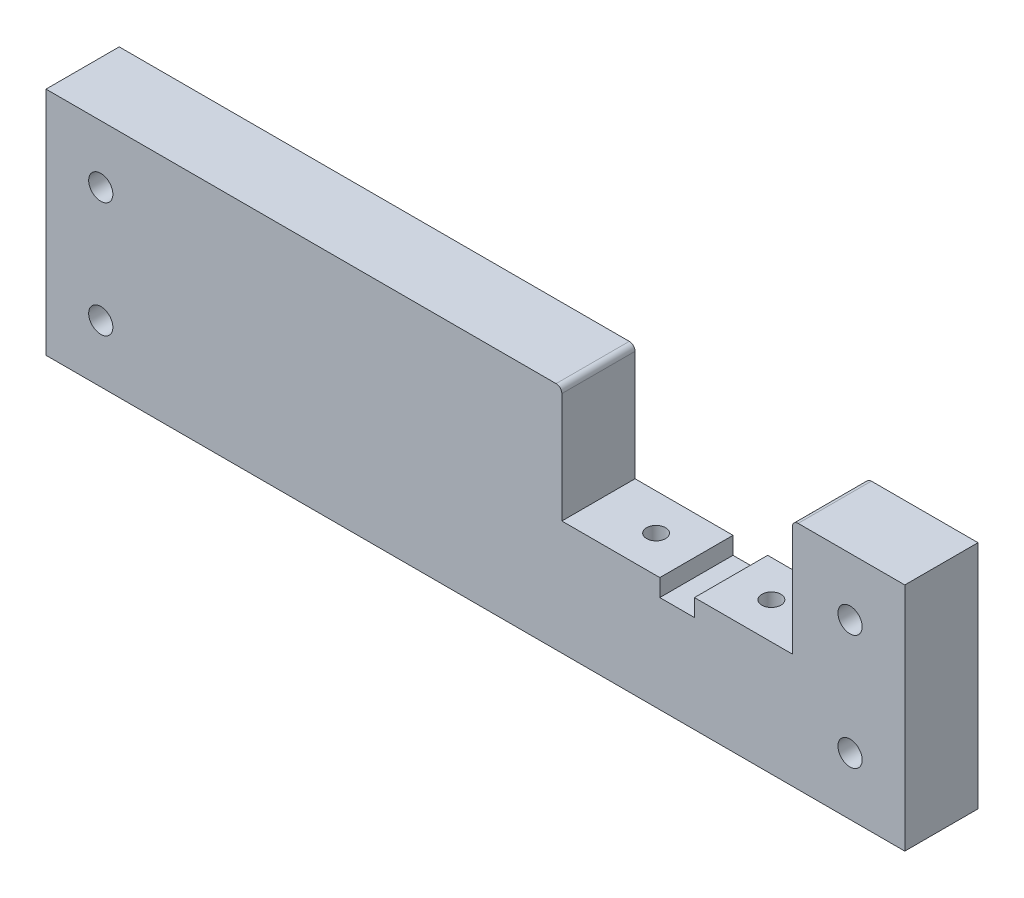
ISO-10303-21;
HEADER;
FILE_DESCRIPTION(('STEP AP214'),'2;1');
FILE_NAME('part.step','',(''),(''),'','','');
FILE_SCHEMA(('AUTOMOTIVE_DESIGN { 1 0 10303 214 1 1 1 1 }'));
ENDSEC;
DATA;
#1=APPLICATION_CONTEXT('core data for automotive mechanical design processes');
#2=APPLICATION_PROTOCOL_DEFINITION('international standard','automotive_design',2000,#1);
#3=PRODUCT_CONTEXT('',#1,'mechanical');
#4=PRODUCT('Part','Part','',(#3));
#5=PRODUCT_RELATED_PRODUCT_CATEGORY('part','',(#4));
#6=PRODUCT_DEFINITION_FORMATION('','',#4);
#7=PRODUCT_DEFINITION_CONTEXT('part definition',#1,'design');
#8=PRODUCT_DEFINITION('design','',#6,#7);
#9=PRODUCT_DEFINITION_SHAPE('','',#8);
#10=(LENGTH_UNIT() NAMED_UNIT(*) SI_UNIT(.MILLI.,.METRE.));
#11=(NAMED_UNIT(*) PLANE_ANGLE_UNIT() SI_UNIT($,.RADIAN.));
#12=(NAMED_UNIT(*) SI_UNIT($,.STERADIAN.) SOLID_ANGLE_UNIT());
#13=UNCERTAINTY_MEASURE_WITH_UNIT(LENGTH_MEASURE(1.E-05),#10,'distance_accuracy_value','');
#14=(GEOMETRIC_REPRESENTATION_CONTEXT(3) GLOBAL_UNCERTAINTY_ASSIGNED_CONTEXT((#13)) GLOBAL_UNIT_ASSIGNED_CONTEXT((#10,
#11,#12)) REPRESENTATION_CONTEXT('',''));
#15=CARTESIAN_POINT('',(0.,0.,0.));
#16=DIRECTION('',(0.,0.,1.));
#17=DIRECTION('',(1.,0.,0.));
#18=AXIS2_PLACEMENT_3D('',#15,#16,#17);
#19=CARTESIAN_POINT('',(55.,0.,-12.7));
#20=DIRECTION('',(1.,0.,0.));
#21=DIRECTION('',(0.,0.,-1.));
#22=AXIS2_PLACEMENT_3D('',#19,#20,#21);
#23=PLANE('',#22);
#24=DIRECTION('',(0.,1.,0.));
#25=VECTOR('',#24,1.);
#26=CARTESIAN_POINT('',(55.,0.,0.));
#27=LINE('',#26,#25);
#28=CARTESIAN_POINT('',(55.,19.855,0.));
#29=VERTEX_POINT('',#28);
#30=CARTESIAN_POINT('',(55.,39.,0.));
#31=VERTEX_POINT('',#30);
#32=EDGE_CURVE('E237',#29,#31,#27,.T.);
#33=ORIENTED_EDGE('',*,*,#32,.T.);
#34=DIRECTION('',(0.,0.,1.));
#35=VECTOR('',#34,1.);
#36=CARTESIAN_POINT('',(55.,39.,-12.7));
#37=LINE('',#36,#35);
#38=CARTESIAN_POINT('',(55.,39.,-12.7));
#39=VERTEX_POINT('',#38);
#40=EDGE_CURVE('E361',#31,#39,#37,.F.);
#41=ORIENTED_EDGE('',*,*,#40,.T.);
#42=DIRECTION('',(0.,1.,0.));
#43=VECTOR('',#42,1.);
#44=CARTESIAN_POINT('',(55.,0.,-12.7));
#45=LINE('',#44,#43);
#46=CARTESIAN_POINT('',(55.,19.855,-12.7));
#47=VERTEX_POINT('',#46);
#48=EDGE_CURVE('E238',#47,#39,#45,.T.);
#49=ORIENTED_EDGE('',*,*,#48,.F.);
#50=DIRECTION('',(0.,0.,1.));
#51=VECTOR('',#50,1.);
#52=CARTESIAN_POINT('',(55.,19.855,-12.7));
#53=LINE('',#52,#51);
#54=EDGE_CURVE('E348',#47,#29,#53,.T.);
#55=ORIENTED_EDGE('',*,*,#54,.T.);
#56=EDGE_LOOP('',(#33,#41,#49,#55));
#57=FACE_BOUND('',#56,.T.);
#58=ADVANCED_FACE('F40',(#57),#23,.F.);
#59=CARTESIAN_POINT('',(0.,40.,-12.7));
#60=DIRECTION('',(0.,-1.,0.));
#61=DIRECTION('',(0.,0.,-1.));
#62=AXIS2_PLACEMENT_3D('',#59,#60,#61);
#63=PLANE('',#62);
#64=DIRECTION('',(1.,0.,0.));
#65=VECTOR('',#64,1.);
#66=CARTESIAN_POINT('',(0.,40.,-12.7));
#67=LINE('',#66,#65);
#68=CARTESIAN_POINT('',(56.,40.,-12.7));
#69=VERTEX_POINT('',#68);
#70=CARTESIAN_POINT('',(74.5,40.,-12.7));
#71=VERTEX_POINT('',#70);
#72=EDGE_CURVE('E267',#69,#71,#67,.T.);
#73=ORIENTED_EDGE('',*,*,#72,.F.);
#74=DIRECTION('',(0.,0.,1.));
#75=VECTOR('',#74,1.);
#76=CARTESIAN_POINT('',(56.,40.,-12.7));
#77=LINE('',#76,#75);
#78=CARTESIAN_POINT('',(56.,40.,0.));
#79=VERTEX_POINT('',#78);
#80=EDGE_CURVE('E322',#69,#79,#77,.T.);
#81=ORIENTED_EDGE('',*,*,#80,.T.);
#82=DIRECTION('',(1.,0.,0.));
#83=VECTOR('',#82,1.);
#84=CARTESIAN_POINT('',(0.,40.,0.));
#85=LINE('',#84,#83);
#86=CARTESIAN_POINT('',(74.5,40.,0.));
#87=VERTEX_POINT('',#86);
#88=EDGE_CURVE('E243',#79,#87,#85,.T.);
#89=ORIENTED_EDGE('',*,*,#88,.T.);
#90=DIRECTION('',(0.,0.,1.));
#91=VECTOR('',#90,1.);
#92=CARTESIAN_POINT('',(74.5,40.,-12.7));
#93=LINE('',#92,#91);
#94=EDGE_CURVE('E318',#71,#87,#93,.T.);
#95=ORIENTED_EDGE('',*,*,#94,.F.);
#96=EDGE_LOOP('',(#73,#81,#89,#95));
#97=FACE_BOUND('',#96,.T.);
#98=ADVANCED_FACE('F414',(#97),#63,.F.);
#99=CARTESIAN_POINT('',(74.5,0.,-12.7));
#100=DIRECTION('',(-1.,0.,0.));
#101=DIRECTION('',(0.,0.,1.));
#102=AXIS2_PLACEMENT_3D('',#99,#100,#101);
#103=PLANE('',#102);
#104=DIRECTION('',(0.,-1.,0.));
#105=VECTOR('',#104,1.);
#106=CARTESIAN_POINT('',(74.5,0.,0.));
#107=LINE('',#106,#105);
#108=CARTESIAN_POINT('',(74.5,0.,0.));
#109=VERTEX_POINT('',#108);
#110=EDGE_CURVE('E314',#87,#109,#107,.T.);
#111=ORIENTED_EDGE('',*,*,#110,.T.);
#112=DIRECTION('',(0.,0.,1.));
#113=VECTOR('',#112,1.);
#114=CARTESIAN_POINT('',(74.5,0.,-12.7));
#115=LINE('',#114,#113);
#116=CARTESIAN_POINT('',(74.5,0.,-12.7));
#117=VERTEX_POINT('',#116);
#118=EDGE_CURVE('E323',#117,#109,#115,.T.);
#119=ORIENTED_EDGE('',*,*,#118,.F.);
#120=DIRECTION('',(0.,-1.,0.));
#121=VECTOR('',#120,1.);
#122=CARTESIAN_POINT('',(74.5,0.,-12.7));
#123=LINE('',#122,#121);
#124=EDGE_CURVE('E275',#71,#117,#123,.T.);
#125=ORIENTED_EDGE('',*,*,#124,.F.);
#126=ORIENTED_EDGE('',*,*,#94,.T.);
#127=EDGE_LOOP('',(#111,#119,#125,#126));
#128=FACE_BOUND('',#127,.T.);
#129=ADVANCED_FACE('F420',(#128),#103,.F.);
#130=CARTESIAN_POINT('',(0.,0.,-12.7));
#131=DIRECTION('',(0.,-1.,0.));
#132=DIRECTION('',(1.,0.,0.));
#133=AXIS2_PLACEMENT_3D('',#130,#131,#132);
#134=PLANE('',#133);
#135=CARTESIAN_POINT('',(-60.,0.,-6.35));
#136=DIRECTION('',(0.,-1.,0.));
#137=DIRECTION('',(0.,0.,-1.));
#138=AXIS2_PLACEMENT_3D('',#135,#136,#137);
#139=CIRCLE('',#138,2.09999999999999);
#140=CARTESIAN_POINT('',(-60.,0.,-8.44999999999999));
#141=VERTEX_POINT('',#140);
#142=EDGE_CURVE('E168',#141,#141,#139,.T.);
#143=ORIENTED_EDGE('',*,*,#142,.F.);
#144=EDGE_LOOP('',(#143));
#145=FACE_BOUND('',#144,.T.);
#146=CARTESIAN_POINT('',(0.,0.,-6.35));
#147=DIRECTION('',(0.,-1.,0.));
#148=DIRECTION('',(0.,0.,-1.));
#149=AXIS2_PLACEMENT_3D('',#146,#147,#148);
#150=CIRCLE('',#149,2.09999999999999);
#151=CARTESIAN_POINT('',(0.,0.,-8.44999999999999));
#152=VERTEX_POINT('',#151);
#153=EDGE_CURVE('E167',#152,#152,#150,.T.);
#154=ORIENTED_EDGE('',*,*,#153,.F.);
#155=EDGE_LOOP('',(#154));
#156=FACE_BOUND('',#155,.T.);
#157=CARTESIAN_POINT('',(60.,0.,-6.35));
#158=DIRECTION('',(0.,-1.,0.));
#159=DIRECTION('',(0.,0.,-1.));
#160=AXIS2_PLACEMENT_3D('',#157,#158,#159);
#161=CIRCLE('',#160,2.09999999999999);
#162=CARTESIAN_POINT('',(60.,0.,-8.44999999999999));
#163=VERTEX_POINT('',#162);
#164=EDGE_CURVE('E181',#163,#163,#161,.T.);
#165=ORIENTED_EDGE('',*,*,#164,.F.);
#166=EDGE_LOOP('',(#165));
#167=FACE_BOUND('',#166,.T.);
#168=DIRECTION('',(1.,0.,0.));
#169=VECTOR('',#168,1.);
#170=CARTESIAN_POINT('',(0.,0.,0.));
#171=LINE('',#170,#169);
#172=CARTESIAN_POINT('',(-74.5,0.,0.));
#173=VERTEX_POINT('',#172);
#174=EDGE_CURVE('E310',#173,#109,#171,.T.);
#175=ORIENTED_EDGE('',*,*,#174,.F.);
#176=DIRECTION('',(0.,0.,1.));
#177=VECTOR('',#176,1.);
#178=CARTESIAN_POINT('',(-74.5,0.,-12.7));
#179=LINE('',#178,#177);
#180=CARTESIAN_POINT('',(-74.5,0.,-12.7));
#181=VERTEX_POINT('',#180);
#182=EDGE_CURVE('E326',#181,#173,#179,.T.);
#183=ORIENTED_EDGE('',*,*,#182,.F.);
#184=DIRECTION('',(1.,0.,0.));
#185=VECTOR('',#184,1.);
#186=CARTESIAN_POINT('',(0.,0.,-12.7));
#187=LINE('',#186,#185);
#188=EDGE_CURVE('E271',#181,#117,#187,.T.);
#189=ORIENTED_EDGE('',*,*,#188,.T.);
#190=ORIENTED_EDGE('',*,*,#118,.T.);
#191=EDGE_LOOP('',(#175,#183,#189,#190));
#192=FACE_BOUND('',#191,.T.);
#193=ADVANCED_FACE('F425',(#145,#156,#167,#192),#134,.T.);
#194=CARTESIAN_POINT('',(-74.5,0.,-12.7));
#195=DIRECTION('',(-1.,0.,0.));
#196=DIRECTION('',(0.,0.,1.));
#197=AXIS2_PLACEMENT_3D('',#194,#195,#196);
#198=PLANE('',#197);
#199=DIRECTION('',(0.,-1.,0.));
#200=VECTOR('',#199,1.);
#201=CARTESIAN_POINT('',(-74.5,0.,0.));
#202=LINE('',#201,#200);
#203=CARTESIAN_POINT('',(-74.5,40.,0.));
#204=VERTEX_POINT('',#203);
#205=EDGE_CURVE('E306',#204,#173,#202,.T.);
#206=ORIENTED_EDGE('',*,*,#205,.F.);
#207=DIRECTION('',(0.,0.,1.));
#208=VECTOR('',#207,1.);
#209=CARTESIAN_POINT('',(-74.5,40.,-12.7));
#210=LINE('',#209,#208);
#211=CARTESIAN_POINT('',(-74.5,40.,-12.7));
#212=VERTEX_POINT('',#211);
#213=EDGE_CURVE('E329',#212,#204,#210,.T.);
#214=ORIENTED_EDGE('',*,*,#213,.F.);
#215=DIRECTION('',(0.,-1.,0.));
#216=VECTOR('',#215,1.);
#217=CARTESIAN_POINT('',(-74.5,0.,-12.7));
#218=LINE('',#217,#216);
#219=EDGE_CURVE('E266',#212,#181,#218,.T.);
#220=ORIENTED_EDGE('',*,*,#219,.T.);
#221=ORIENTED_EDGE('',*,*,#182,.T.);
#222=EDGE_LOOP('',(#206,#214,#220,#221));
#223=FACE_BOUND('',#222,.T.);
#224=ADVANCED_FACE('F429',(#223),#198,.T.);
#225=CARTESIAN_POINT('',(14.,40.,0.));
#226=VERTEX_POINT('',#225);
#227=EDGE_CURVE('E303',#204,#226,#85,.T.);
#228=ORIENTED_EDGE('',*,*,#227,.T.);
#229=DIRECTION('',(0.,0.,1.));
#230=VECTOR('',#229,1.);
#231=CARTESIAN_POINT('',(14.,40.,-12.7));
#232=LINE('',#231,#230);
#233=CARTESIAN_POINT('',(14.,40.,-12.7));
#234=VERTEX_POINT('',#233);
#235=EDGE_CURVE('E11',#226,#234,#232,.F.);
#236=ORIENTED_EDGE('',*,*,#235,.T.);
#237=EDGE_CURVE('E263',#212,#234,#67,.T.);
#238=ORIENTED_EDGE('',*,*,#237,.F.);
#239=ORIENTED_EDGE('',*,*,#213,.T.);
#240=EDGE_LOOP('',(#228,#236,#238,#239));
#241=FACE_BOUND('',#240,.T.);
#242=ADVANCED_FACE('F430',(#241),#63,.F.);
#243=CARTESIAN_POINT('',(15.,0.,-12.7));
#244=DIRECTION('',(1.,0.,0.));
#245=DIRECTION('',(0.,1.,0.));
#246=AXIS2_PLACEMENT_3D('',#243,#244,#245);
#247=PLANE('',#246);
#248=DIRECTION('',(0.,1.,0.));
#249=VECTOR('',#248,1.);
#250=CARTESIAN_POINT('',(15.,0.,-12.7));
#251=LINE('',#250,#249);
#252=CARTESIAN_POINT('',(15.,19.855,-12.7));
#253=VERTEX_POINT('',#252);
#254=CARTESIAN_POINT('',(15.,39.,-12.7));
#255=VERTEX_POINT('',#254);
#256=EDGE_CURVE('E260',#253,#255,#251,.T.);
#257=ORIENTED_EDGE('',*,*,#256,.T.);
#258=DIRECTION('',(0.,0.,1.));
#259=VECTOR('',#258,1.);
#260=CARTESIAN_POINT('',(15.,39.,0.));
#261=LINE('',#260,#259);
#262=CARTESIAN_POINT('',(15.,39.,0.));
#263=VERTEX_POINT('',#262);
#264=EDGE_CURVE('E49',#255,#263,#261,.T.);
#265=ORIENTED_EDGE('',*,*,#264,.T.);
#266=DIRECTION('',(0.,1.,0.));
#267=VECTOR('',#266,1.);
#268=CARTESIAN_POINT('',(15.,0.,0.));
#269=LINE('',#268,#267);
#270=CARTESIAN_POINT('',(15.,19.855,0.));
#271=VERTEX_POINT('',#270);
#272=EDGE_CURVE('E299',#271,#263,#269,.T.);
#273=ORIENTED_EDGE('',*,*,#272,.F.);
#274=DIRECTION('',(0.,0.,1.));
#275=VECTOR('',#274,1.);
#276=CARTESIAN_POINT('',(15.,19.855,-12.7));
#277=LINE('',#276,#275);
#278=EDGE_CURVE('E332',#253,#271,#277,.T.);
#279=ORIENTED_EDGE('',*,*,#278,.F.);
#280=EDGE_LOOP('',(#257,#265,#273,#279));
#281=FACE_BOUND('',#280,.T.);
#282=ADVANCED_FACE('F373',(#281),#247,.T.);
#283=CARTESIAN_POINT('',(0.,19.855,-12.7));
#284=DIRECTION('',(0.,1.,0.));
#285=DIRECTION('',(-1.,0.,0.));
#286=AXIS2_PLACEMENT_3D('',#283,#284,#285);
#287=PLANE('',#286);
#288=CARTESIAN_POINT('',(25.,19.855,-6.35));
#289=DIRECTION('',(0.,1.,0.));
#290=DIRECTION('',(0.,0.,1.));
#291=AXIS2_PLACEMENT_3D('',#288,#289,#290);
#292=CIRCLE('',#291,1.64999999999999);
#293=CARTESIAN_POINT('',(25.,19.855,-4.70000000000001));
#294=VERTEX_POINT('',#293);
#295=EDGE_CURVE('E221',#294,#294,#292,.T.);
#296=ORIENTED_EDGE('',*,*,#295,.F.);
#297=EDGE_LOOP('',(#296));
#298=FACE_BOUND('',#297,.T.);
#299=DIRECTION('',(-1.,0.,0.));
#300=VECTOR('',#299,1.);
#301=CARTESIAN_POINT('',(0.,19.855,0.));
#302=LINE('',#301,#300);
#303=CARTESIAN_POINT('',(31.995,19.855,0.));
#304=VERTEX_POINT('',#303);
#305=EDGE_CURVE('E295',#304,#271,#302,.T.);
#306=ORIENTED_EDGE('',*,*,#305,.F.);
#307=DIRECTION('',(0.,0.,1.));
#308=VECTOR('',#307,1.);
#309=CARTESIAN_POINT('',(31.995,19.855,-12.7));
#310=LINE('',#309,#308);
#311=CARTESIAN_POINT('',(31.995,19.855,-12.7));
#312=VERTEX_POINT('',#311);
#313=EDGE_CURVE('E335',#312,#304,#310,.T.);
#314=ORIENTED_EDGE('',*,*,#313,.F.);
#315=DIRECTION('',(-1.,0.,0.));
#316=VECTOR('',#315,1.);
#317=CARTESIAN_POINT('',(0.,19.855,-12.7));
#318=LINE('',#317,#316);
#319=EDGE_CURVE('E256',#312,#253,#318,.T.);
#320=ORIENTED_EDGE('',*,*,#319,.T.);
#321=ORIENTED_EDGE('',*,*,#278,.T.);
#322=EDGE_LOOP('',(#306,#314,#320,#321));
#323=FACE_BOUND('',#322,.T.);
#324=ADVANCED_FACE('F383',(#298,#323),#287,.T.);
#325=CARTESIAN_POINT('',(31.995,0.,-12.7));
#326=DIRECTION('',(-1.,0.,0.));
#327=DIRECTION('',(0.,0.,1.));
#328=AXIS2_PLACEMENT_3D('',#325,#326,#327);
#329=PLANE('',#328);
#330=DIRECTION('',(0.,-1.,0.));
#331=VECTOR('',#330,1.);
#332=CARTESIAN_POINT('',(31.995,0.,0.));
#333=LINE('',#332,#331);
#334=CARTESIAN_POINT('',(31.995,16.85,0.));
#335=VERTEX_POINT('',#334);
#336=EDGE_CURVE('E292',#304,#335,#333,.T.);
#337=ORIENTED_EDGE('',*,*,#336,.T.);
#338=DIRECTION('',(0.,0.,1.));
#339=VECTOR('',#338,1.);
#340=CARTESIAN_POINT('',(31.995,16.85,-12.7));
#341=LINE('',#340,#339);
#342=CARTESIAN_POINT('',(31.995,16.85,-12.7));
#343=VERTEX_POINT('',#342);
#344=EDGE_CURVE('E338',#343,#335,#341,.T.);
#345=ORIENTED_EDGE('',*,*,#344,.F.);
#346=DIRECTION('',(0.,-1.,0.));
#347=VECTOR('',#346,1.);
#348=CARTESIAN_POINT('',(31.995,0.,-12.7));
#349=LINE('',#348,#347);
#350=EDGE_CURVE('E253',#312,#343,#349,.T.);
#351=ORIENTED_EDGE('',*,*,#350,.F.);
#352=ORIENTED_EDGE('',*,*,#313,.T.);
#353=EDGE_LOOP('',(#337,#345,#351,#352));
#354=FACE_BOUND('',#353,.T.);
#355=ADVANCED_FACE('F392',(#354),#329,.F.);
#356=CARTESIAN_POINT('',(0.,16.85,-12.7));
#357=DIRECTION('',(0.,-1.,0.));
#358=DIRECTION('',(0.,0.,-1.));
#359=AXIS2_PLACEMENT_3D('',#356,#357,#358);
#360=PLANE('',#359);
#361=DIRECTION('',(1.,0.,0.));
#362=VECTOR('',#361,1.);
#363=CARTESIAN_POINT('',(0.,16.85,0.));
#364=LINE('',#363,#362);
#365=CARTESIAN_POINT('',(38.005,16.85,0.));
#366=VERTEX_POINT('',#365);
#367=EDGE_CURVE('E288',#335,#366,#364,.T.);
#368=ORIENTED_EDGE('',*,*,#367,.T.);
#369=DIRECTION('',(0.,0.,1.));
#370=VECTOR('',#369,1.);
#371=CARTESIAN_POINT('',(38.005,16.85,-12.7));
#372=LINE('',#371,#370);
#373=CARTESIAN_POINT('',(38.005,16.85,-12.7));
#374=VERTEX_POINT('',#373);
#375=EDGE_CURVE('E342',#374,#366,#372,.T.);
#376=ORIENTED_EDGE('',*,*,#375,.F.);
#377=DIRECTION('',(1.,0.,0.));
#378=VECTOR('',#377,1.);
#379=CARTESIAN_POINT('',(0.,16.85,-12.7));
#380=LINE('',#379,#378);
#381=EDGE_CURVE('E250',#343,#374,#380,.T.);
#382=ORIENTED_EDGE('',*,*,#381,.F.);
#383=ORIENTED_EDGE('',*,*,#344,.T.);
#384=EDGE_LOOP('',(#368,#376,#382,#383));
#385=FACE_BOUND('',#384,.T.);
#386=ADVANCED_FACE('F394',(#385),#360,.F.);
#387=CARTESIAN_POINT('',(38.005,0.,-12.7));
#388=DIRECTION('',(-1.,0.,0.));
#389=DIRECTION('',(0.,0.,1.));
#390=AXIS2_PLACEMENT_3D('',#387,#388,#389);
#391=PLANE('',#390);
#392=DIRECTION('',(0.,-1.,0.));
#393=VECTOR('',#392,1.);
#394=CARTESIAN_POINT('',(38.005,0.,0.));
#395=LINE('',#394,#393);
#396=CARTESIAN_POINT('',(38.005,19.855,0.));
#397=VERTEX_POINT('',#396);
#398=EDGE_CURVE('E284',#397,#366,#395,.T.);
#399=ORIENTED_EDGE('',*,*,#398,.F.);
#400=DIRECTION('',(0.,0.,1.));
#401=VECTOR('',#400,1.);
#402=CARTESIAN_POINT('',(38.005,19.855,-12.7));
#403=LINE('',#402,#401);
#404=CARTESIAN_POINT('',(38.005,19.855,-12.7));
#405=VERTEX_POINT('',#404);
#406=EDGE_CURVE('E345',#405,#397,#403,.T.);
#407=ORIENTED_EDGE('',*,*,#406,.F.);
#408=DIRECTION('',(0.,-1.,0.));
#409=VECTOR('',#408,1.);
#410=CARTESIAN_POINT('',(38.005,0.,-12.7));
#411=LINE('',#410,#409);
#412=EDGE_CURVE('E246',#405,#374,#411,.T.);
#413=ORIENTED_EDGE('',*,*,#412,.T.);
#414=ORIENTED_EDGE('',*,*,#375,.T.);
#415=EDGE_LOOP('',(#399,#407,#413,#414));
#416=FACE_BOUND('',#415,.T.);
#417=ADVANCED_FACE('F397',(#416),#391,.T.);
#418=CARTESIAN_POINT('',(0.,19.855,-12.7));
#419=DIRECTION('',(0.,-1.,0.));
#420=DIRECTION('',(1.,0.,0.));
#421=AXIS2_PLACEMENT_3D('',#418,#419,#420);
#422=PLANE('',#421);
#423=CARTESIAN_POINT('',(45.,19.855,-6.35));
#424=DIRECTION('',(0.,1.,0.));
#425=DIRECTION('',(0.,0.,1.));
#426=AXIS2_PLACEMENT_3D('',#423,#424,#425);
#427=CIRCLE('',#426,1.64999999999999);
#428=CARTESIAN_POINT('',(45.,19.855,-4.70000000000001));
#429=VERTEX_POINT('',#428);
#430=EDGE_CURVE('E229',#429,#429,#427,.T.);
#431=ORIENTED_EDGE('',*,*,#430,.F.);
#432=EDGE_LOOP('',(#431));
#433=FACE_BOUND('',#432,.T.);
#434=DIRECTION('',(1.,0.,0.));
#435=VECTOR('',#434,1.);
#436=CARTESIAN_POINT('',(0.,19.855,0.));
#437=LINE('',#436,#435);
#438=EDGE_CURVE('E281',#397,#29,#437,.T.);
#439=ORIENTED_EDGE('',*,*,#438,.T.);
#440=ORIENTED_EDGE('',*,*,#54,.F.);
#441=DIRECTION('',(1.,0.,0.));
#442=VECTOR('',#441,1.);
#443=CARTESIAN_POINT('',(0.,19.855,-12.7));
#444=LINE('',#443,#442);
#445=EDGE_CURVE('E242',#405,#47,#444,.T.);
#446=ORIENTED_EDGE('',*,*,#445,.F.);
#447=ORIENTED_EDGE('',*,*,#406,.T.);
#448=EDGE_LOOP('',(#439,#440,#446,#447));
#449=FACE_BOUND('',#448,.T.);
#450=ADVANCED_FACE('F403',(#433,#449),#422,.F.);
#451=CARTESIAN_POINT('',(0.,0.,-12.7));
#452=DIRECTION('',(0.,0.,1.));
#453=DIRECTION('',(1.,0.,0.));
#454=AXIS2_PLACEMENT_3D('',#451,#452,#453);
#455=PLANE('',#454);
#456=CARTESIAN_POINT('',(-65.,30.,-12.7));
#457=DIRECTION('',(0.,0.,1.));
#458=DIRECTION('',(1.,0.,0.));
#459=AXIS2_PLACEMENT_3D('',#456,#457,#458);
#460=CIRCLE('',#459,2.09999999999999);
#461=CARTESIAN_POINT('',(-62.9,30.,-12.7));
#462=VERTEX_POINT('',#461);
#463=EDGE_CURVE('E193',#462,#462,#460,.T.);
#464=ORIENTED_EDGE('',*,*,#463,.T.);
#465=EDGE_LOOP('',(#464));
#466=FACE_BOUND('',#465,.T.);
#467=CARTESIAN_POINT('',(-65.,10.,-12.7));
#468=DIRECTION('',(0.,0.,1.));
#469=DIRECTION('',(1.,0.,0.));
#470=AXIS2_PLACEMENT_3D('',#467,#468,#469);
#471=CIRCLE('',#470,2.09999999999999);
#472=CARTESIAN_POINT('',(-62.9,10.,-12.7));
#473=VERTEX_POINT('',#472);
#474=EDGE_CURVE('E201',#473,#473,#471,.T.);
#475=ORIENTED_EDGE('',*,*,#474,.T.);
#476=EDGE_LOOP('',(#475));
#477=FACE_BOUND('',#476,.T.);
#478=CARTESIAN_POINT('',(65.,10.,-12.7));
#479=DIRECTION('',(0.,0.,1.));
#480=DIRECTION('',(1.,0.,0.));
#481=AXIS2_PLACEMENT_3D('',#478,#479,#480);
#482=CIRCLE('',#481,2.09999999999999);
#483=CARTESIAN_POINT('',(67.1,10.,-12.7));
#484=VERTEX_POINT('',#483);
#485=EDGE_CURVE('E209',#484,#484,#482,.T.);
#486=ORIENTED_EDGE('',*,*,#485,.T.);
#487=EDGE_LOOP('',(#486));
#488=FACE_BOUND('',#487,.T.);
#489=CARTESIAN_POINT('',(65.,30.,-12.7));
#490=DIRECTION('',(0.,0.,1.));
#491=DIRECTION('',(1.,0.,0.));
#492=AXIS2_PLACEMENT_3D('',#489,#490,#491);
#493=CIRCLE('',#492,2.09999999999999);
#494=CARTESIAN_POINT('',(67.1,30.,-12.7));
#495=VERTEX_POINT('',#494);
#496=EDGE_CURVE('E217',#495,#495,#493,.T.);
#497=ORIENTED_EDGE('',*,*,#496,.T.);
#498=EDGE_LOOP('',(#497));
#499=FACE_BOUND('',#498,.T.);
#500=ORIENTED_EDGE('',*,*,#48,.T.);
#501=CARTESIAN_POINT('',(56.,39.,-12.7));
#502=DIRECTION('',(0.,0.,1.));
#503=DIRECTION('',(1.,0.,0.));
#504=AXIS2_PLACEMENT_3D('',#501,#502,#503);
#505=CIRCLE('',#504,1.);
#506=EDGE_CURVE('E366',#39,#69,#505,.F.);
#507=ORIENTED_EDGE('',*,*,#506,.T.);
#508=ORIENTED_EDGE('',*,*,#72,.T.);
#509=ORIENTED_EDGE('',*,*,#124,.T.);
#510=ORIENTED_EDGE('',*,*,#188,.F.);
#511=ORIENTED_EDGE('',*,*,#219,.F.);
#512=ORIENTED_EDGE('',*,*,#237,.T.);
#513=CARTESIAN_POINT('',(14.,39.,-12.7));
#514=DIRECTION('',(0.,0.,1.));
#515=DIRECTION('',(1.,0.,0.));
#516=AXIS2_PLACEMENT_3D('',#513,#514,#515);
#517=CIRCLE('',#516,1.);
#518=EDGE_CURVE('E56',#234,#255,#517,.F.);
#519=ORIENTED_EDGE('',*,*,#518,.T.);
#520=ORIENTED_EDGE('',*,*,#256,.F.);
#521=ORIENTED_EDGE('',*,*,#319,.F.);
#522=ORIENTED_EDGE('',*,*,#350,.T.);
#523=ORIENTED_EDGE('',*,*,#381,.T.);
#524=ORIENTED_EDGE('',*,*,#412,.F.);
#525=ORIENTED_EDGE('',*,*,#445,.T.);
#526=EDGE_LOOP('',(#500,#507,#508,#509,#510,#511,#512,#519,#520,#521,#522,#523,#524,#525));
#527=FACE_BOUND('',#526,.T.);
#528=ADVANCED_FACE('F386',(#466,#477,#488,#499,#527),#455,.F.);
#529=CARTESIAN_POINT('',(0.,0.,0.));
#530=DIRECTION('',(0.,0.,1.));
#531=DIRECTION('',(1.,0.,0.));
#532=AXIS2_PLACEMENT_3D('',#529,#530,#531);
#533=PLANE('',#532);
#534=CARTESIAN_POINT('',(-65.,30.,0.));
#535=DIRECTION('',(0.,0.,1.));
#536=DIRECTION('',(1.,0.,0.));
#537=AXIS2_PLACEMENT_3D('',#534,#535,#536);
#538=CIRCLE('',#537,2.09999999999999);
#539=CARTESIAN_POINT('',(-62.9,30.,0.));
#540=VERTEX_POINT('',#539);
#541=EDGE_CURVE('E189',#540,#540,#538,.T.);
#542=ORIENTED_EDGE('',*,*,#541,.F.);
#543=EDGE_LOOP('',(#542));
#544=FACE_BOUND('',#543,.T.);
#545=CARTESIAN_POINT('',(-65.,10.,0.));
#546=DIRECTION('',(0.,0.,1.));
#547=DIRECTION('',(1.,0.,0.));
#548=AXIS2_PLACEMENT_3D('',#545,#546,#547);
#549=CIRCLE('',#548,2.09999999999999);
#550=CARTESIAN_POINT('',(-62.9,10.,0.));
#551=VERTEX_POINT('',#550);
#552=EDGE_CURVE('E197',#551,#551,#549,.T.);
#553=ORIENTED_EDGE('',*,*,#552,.F.);
#554=EDGE_LOOP('',(#553));
#555=FACE_BOUND('',#554,.T.);
#556=CARTESIAN_POINT('',(65.,10.,0.));
#557=DIRECTION('',(0.,0.,1.));
#558=DIRECTION('',(1.,0.,0.));
#559=AXIS2_PLACEMENT_3D('',#556,#557,#558);
#560=CIRCLE('',#559,2.09999999999999);
#561=CARTESIAN_POINT('',(67.1,10.,0.));
#562=VERTEX_POINT('',#561);
#563=EDGE_CURVE('E205',#562,#562,#560,.T.);
#564=ORIENTED_EDGE('',*,*,#563,.F.);
#565=EDGE_LOOP('',(#564));
#566=FACE_BOUND('',#565,.T.);
#567=CARTESIAN_POINT('',(65.,30.,0.));
#568=DIRECTION('',(0.,0.,1.));
#569=DIRECTION('',(1.,0.,0.));
#570=AXIS2_PLACEMENT_3D('',#567,#568,#569);
#571=CIRCLE('',#570,2.09999999999999);
#572=CARTESIAN_POINT('',(67.1,30.,0.));
#573=VERTEX_POINT('',#572);
#574=EDGE_CURVE('E213',#573,#573,#571,.T.);
#575=ORIENTED_EDGE('',*,*,#574,.F.);
#576=EDGE_LOOP('',(#575));
#577=FACE_BOUND('',#576,.T.);
#578=ORIENTED_EDGE('',*,*,#88,.F.);
#579=CARTESIAN_POINT('',(56.,39.,0.));
#580=DIRECTION('',(0.,0.,1.));
#581=DIRECTION('',(1.,0.,0.));
#582=AXIS2_PLACEMENT_3D('',#579,#580,#581);
#583=CIRCLE('',#582,1.);
#584=EDGE_CURVE('E358',#79,#31,#583,.T.);
#585=ORIENTED_EDGE('',*,*,#584,.T.);
#586=ORIENTED_EDGE('',*,*,#32,.F.);
#587=ORIENTED_EDGE('',*,*,#438,.F.);
#588=ORIENTED_EDGE('',*,*,#398,.T.);
#589=ORIENTED_EDGE('',*,*,#367,.F.);
#590=ORIENTED_EDGE('',*,*,#336,.F.);
#591=ORIENTED_EDGE('',*,*,#305,.T.);
#592=ORIENTED_EDGE('',*,*,#272,.T.);
#593=CARTESIAN_POINT('',(14.,39.,0.));
#594=DIRECTION('',(0.,0.,1.));
#595=DIRECTION('',(1.,0.,0.));
#596=AXIS2_PLACEMENT_3D('',#593,#594,#595);
#597=CIRCLE('',#596,1.);
#598=EDGE_CURVE('E355',#263,#226,#597,.T.);
#599=ORIENTED_EDGE('',*,*,#598,.T.);
#600=ORIENTED_EDGE('',*,*,#227,.F.);
#601=ORIENTED_EDGE('',*,*,#205,.T.);
#602=ORIENTED_EDGE('',*,*,#174,.T.);
#603=ORIENTED_EDGE('',*,*,#110,.F.);
#604=EDGE_LOOP('',(#578,#585,#586,#587,#588,#589,#590,#591,#592,#599,#600,#601,#602,#603));
#605=FACE_BOUND('',#604,.T.);
#606=ADVANCED_FACE('F377',(#544,#555,#566,#577,#605),#533,.T.);
#607=CARTESIAN_POINT('',(45.,14.855,-6.35));
#608=DIRECTION('',(0.,1.,0.));
#609=DIRECTION('',(0.,0.,1.));
#610=AXIS2_PLACEMENT_3D('',#607,#608,#609);
#611=CONICAL_SURFACE('',#610,1.65,1.02974425867666);
#612=CARTESIAN_POINT('',(45.,13.8635799786045,-6.35));
#613=VERTEX_POINT('',#612);
#614=VERTEX_LOOP('',#613);
#615=FACE_BOUND('',#614,.T.);
#616=CARTESIAN_POINT('',(45.,14.855,-6.35));
#617=DIRECTION('',(0.,1.,0.));
#618=DIRECTION('',(0.,0.,1.));
#619=AXIS2_PLACEMENT_3D('',#616,#617,#618);
#620=CIRCLE('',#619,1.65);
#621=CARTESIAN_POINT('',(45.,14.855,-4.7));
#622=VERTEX_POINT('',#621);
#623=EDGE_CURVE('E233',#622,#622,#620,.T.);
#624=ORIENTED_EDGE('',*,*,#623,.T.);
#625=EDGE_LOOP('',(#624));
#626=FACE_BOUND('',#625,.T.);
#627=ADVANCED_FACE('F466',(#615,#626),#611,.F.);
#628=CARTESIAN_POINT('',(45.,19.855,-6.35));
#629=DIRECTION('',(0.,1.,0.));
#630=DIRECTION('',(0.,0.,1.));
#631=AXIS2_PLACEMENT_3D('',#628,#629,#630);
#632=CYLINDRICAL_SURFACE('',#631,1.65);
#633=ORIENTED_EDGE('',*,*,#623,.F.);
#634=EDGE_LOOP('',(#633));
#635=FACE_BOUND('',#634,.T.);
#636=ORIENTED_EDGE('',*,*,#430,.T.);
#637=EDGE_LOOP('',(#636));
#638=FACE_BOUND('',#637,.T.);
#639=ADVANCED_FACE('F473',(#635,#638),#632,.F.);
#640=CARTESIAN_POINT('',(25.,14.855,-6.35));
#641=DIRECTION('',(0.,1.,0.));
#642=DIRECTION('',(0.,0.,1.));
#643=AXIS2_PLACEMENT_3D('',#640,#641,#642);
#644=CONICAL_SURFACE('',#643,1.65,1.02974425867665);
#645=CARTESIAN_POINT('',(25.,13.8635799786045,-6.35));
#646=VERTEX_POINT('',#645);
#647=VERTEX_LOOP('',#646);
#648=FACE_BOUND('',#647,.T.);
#649=CARTESIAN_POINT('',(25.,14.855,-6.35));
#650=DIRECTION('',(0.,1.,0.));
#651=DIRECTION('',(0.,0.,1.));
#652=AXIS2_PLACEMENT_3D('',#649,#650,#651);
#653=CIRCLE('',#652,1.65);
#654=CARTESIAN_POINT('',(25.,14.855,-4.7));
#655=VERTEX_POINT('',#654);
#656=EDGE_CURVE('E225',#655,#655,#653,.T.);
#657=ORIENTED_EDGE('',*,*,#656,.T.);
#658=EDGE_LOOP('',(#657));
#659=FACE_BOUND('',#658,.T.);
#660=ADVANCED_FACE('F477',(#648,#659),#644,.F.);
#661=CARTESIAN_POINT('',(25.,19.855,-6.35));
#662=DIRECTION('',(0.,1.,0.));
#663=DIRECTION('',(0.,0.,1.));
#664=AXIS2_PLACEMENT_3D('',#661,#662,#663);
#665=CYLINDRICAL_SURFACE('',#664,1.64999999999999);
#666=ORIENTED_EDGE('',*,*,#656,.F.);
#667=EDGE_LOOP('',(#666));
#668=FACE_BOUND('',#667,.T.);
#669=ORIENTED_EDGE('',*,*,#295,.T.);
#670=EDGE_LOOP('',(#669));
#671=FACE_BOUND('',#670,.T.);
#672=ADVANCED_FACE('F481',(#668,#671),#665,.F.);
#673=CARTESIAN_POINT('',(65.,30.,0.));
#674=DIRECTION('',(0.,0.,1.));
#675=DIRECTION('',(1.,0.,0.));
#676=AXIS2_PLACEMENT_3D('',#673,#674,#675);
#677=CYLINDRICAL_SURFACE('',#676,2.09999999999999);
#678=ORIENTED_EDGE('',*,*,#496,.F.);
#679=EDGE_LOOP('',(#678));
#680=FACE_BOUND('',#679,.T.);
#681=ORIENTED_EDGE('',*,*,#574,.T.);
#682=EDGE_LOOP('',(#681));
#683=FACE_BOUND('',#682,.T.);
#684=ADVANCED_FACE('F485',(#680,#683),#677,.F.);
#685=CARTESIAN_POINT('',(65.,10.,0.));
#686=DIRECTION('',(0.,0.,1.));
#687=DIRECTION('',(1.,0.,0.));
#688=AXIS2_PLACEMENT_3D('',#685,#686,#687);
#689=CYLINDRICAL_SURFACE('',#688,2.09999999999999);
#690=ORIENTED_EDGE('',*,*,#485,.F.);
#691=EDGE_LOOP('',(#690));
#692=FACE_BOUND('',#691,.T.);
#693=ORIENTED_EDGE('',*,*,#563,.T.);
#694=EDGE_LOOP('',(#693));
#695=FACE_BOUND('',#694,.T.);
#696=ADVANCED_FACE('F489',(#692,#695),#689,.F.);
#697=CARTESIAN_POINT('',(-65.,10.,0.));
#698=DIRECTION('',(0.,0.,1.));
#699=DIRECTION('',(1.,0.,0.));
#700=AXIS2_PLACEMENT_3D('',#697,#698,#699);
#701=CYLINDRICAL_SURFACE('',#700,2.09999999999999);
#702=ORIENTED_EDGE('',*,*,#474,.F.);
#703=EDGE_LOOP('',(#702));
#704=FACE_BOUND('',#703,.T.);
#705=ORIENTED_EDGE('',*,*,#552,.T.);
#706=EDGE_LOOP('',(#705));
#707=FACE_BOUND('',#706,.T.);
#708=ADVANCED_FACE('F493',(#704,#707),#701,.F.);
#709=CARTESIAN_POINT('',(-65.,30.,0.));
#710=DIRECTION('',(0.,0.,1.));
#711=DIRECTION('',(1.,0.,0.));
#712=AXIS2_PLACEMENT_3D('',#709,#710,#711);
#713=CYLINDRICAL_SURFACE('',#712,2.09999999999999);
#714=ORIENTED_EDGE('',*,*,#463,.F.);
#715=EDGE_LOOP('',(#714));
#716=FACE_BOUND('',#715,.T.);
#717=ORIENTED_EDGE('',*,*,#541,.T.);
#718=EDGE_LOOP('',(#717));
#719=FACE_BOUND('',#718,.T.);
#720=ADVANCED_FACE('F497',(#716,#719),#713,.F.);
#721=CARTESIAN_POINT('',(60.,7.00000000000001,-6.35));
#722=DIRECTION('',(0.,-1.,0.));
#723=DIRECTION('',(0.,0.,-1.));
#724=AXIS2_PLACEMENT_3D('',#721,#722,#723);
#725=CONICAL_SURFACE('',#724,2.1,1.02974425867665);
#726=CARTESIAN_POINT('',(60.,8.26180729995789,-6.35));
#727=VERTEX_POINT('',#726);
#728=VERTEX_LOOP('',#727);
#729=FACE_BOUND('',#728,.T.);
#730=CARTESIAN_POINT('',(60.,7.00000000000001,-6.35));
#731=DIRECTION('',(0.,-1.,0.));
#732=DIRECTION('',(0.,0.,-1.));
#733=AXIS2_PLACEMENT_3D('',#730,#731,#732);
#734=CIRCLE('',#733,2.1);
#735=CARTESIAN_POINT('',(60.,7.00000000000001,-8.45));
#736=VERTEX_POINT('',#735);
#737=EDGE_CURVE('E185',#736,#736,#734,.T.);
#738=ORIENTED_EDGE('',*,*,#737,.T.);
#739=EDGE_LOOP('',(#738));
#740=FACE_BOUND('',#739,.T.);
#741=ADVANCED_FACE('F501',(#729,#740),#725,.F.);
#742=CARTESIAN_POINT('',(60.,0.,-6.35));
#743=DIRECTION('',(0.,-1.,0.));
#744=DIRECTION('',(0.,0.,-1.));
#745=AXIS2_PLACEMENT_3D('',#742,#743,#744);
#746=CYLINDRICAL_SURFACE('',#745,2.09999999999999);
#747=ORIENTED_EDGE('',*,*,#737,.F.);
#748=EDGE_LOOP('',(#747));
#749=FACE_BOUND('',#748,.T.);
#750=ORIENTED_EDGE('',*,*,#164,.T.);
#751=EDGE_LOOP('',(#750));
#752=FACE_BOUND('',#751,.T.);
#753=ADVANCED_FACE('F505',(#749,#752),#746,.F.);
#754=CARTESIAN_POINT('',(0.,7.,-6.35));
#755=DIRECTION('',(0.,-1.,0.));
#756=DIRECTION('',(0.,0.,-1.));
#757=AXIS2_PLACEMENT_3D('',#754,#755,#756);
#758=CONICAL_SURFACE('',#757,2.1,1.02974425867665);
#759=CARTESIAN_POINT('',(0.,8.26180729995788,-6.35));
#760=VERTEX_POINT('',#759);
#761=VERTEX_LOOP('',#760);
#762=FACE_BOUND('',#761,.T.);
#763=CARTESIAN_POINT('',(0.,7.,-6.35));
#764=DIRECTION('',(0.,-1.,0.));
#765=DIRECTION('',(0.,0.,-1.));
#766=AXIS2_PLACEMENT_3D('',#763,#764,#765);
#767=CIRCLE('',#766,2.1);
#768=CARTESIAN_POINT('',(0.,7.,-8.45));
#769=VERTEX_POINT('',#768);
#770=EDGE_CURVE('E173',#769,#769,#767,.T.);
#771=ORIENTED_EDGE('',*,*,#770,.T.);
#772=EDGE_LOOP('',(#771));
#773=FACE_BOUND('',#772,.T.);
#774=ADVANCED_FACE('F509',(#762,#773),#758,.F.);
#775=CARTESIAN_POINT('',(0.,0.,-6.35));
#776=DIRECTION('',(0.,-1.,0.));
#777=DIRECTION('',(0.,0.,-1.));
#778=AXIS2_PLACEMENT_3D('',#775,#776,#777);
#779=CYLINDRICAL_SURFACE('',#778,2.09999999999999);
#780=ORIENTED_EDGE('',*,*,#770,.F.);
#781=EDGE_LOOP('',(#780));
#782=FACE_BOUND('',#781,.T.);
#783=ORIENTED_EDGE('',*,*,#153,.T.);
#784=EDGE_LOOP('',(#783));
#785=FACE_BOUND('',#784,.T.);
#786=ADVANCED_FACE('F160',(#782,#785),#779,.F.);
#787=CARTESIAN_POINT('',(-60.,6.99999999999999,-6.35));
#788=DIRECTION('',(0.,-1.,0.));
#789=DIRECTION('',(0.,0.,-1.));
#790=AXIS2_PLACEMENT_3D('',#787,#788,#789);
#791=CONICAL_SURFACE('',#790,2.1,1.02974425867665);
#792=CARTESIAN_POINT('',(-60.,8.26180729995787,-6.35));
#793=VERTEX_POINT('',#792);
#794=VERTEX_LOOP('',#793);
#795=FACE_BOUND('',#794,.T.);
#796=CARTESIAN_POINT('',(-60.,6.99999999999999,-6.35));
#797=DIRECTION('',(0.,-1.,0.));
#798=DIRECTION('',(0.,0.,-1.));
#799=AXIS2_PLACEMENT_3D('',#796,#797,#798);
#800=CIRCLE('',#799,2.1);
#801=CARTESIAN_POINT('',(-60.,6.99999999999999,-8.45));
#802=VERTEX_POINT('',#801);
#803=EDGE_CURVE('E164',#802,#802,#800,.T.);
#804=ORIENTED_EDGE('',*,*,#803,.T.);
#805=EDGE_LOOP('',(#804));
#806=FACE_BOUND('',#805,.T.);
#807=ADVANCED_FACE('F156',(#795,#806),#791,.F.);
#808=CARTESIAN_POINT('',(-60.,0.,-6.35));
#809=DIRECTION('',(0.,-1.,0.));
#810=DIRECTION('',(0.,0.,-1.));
#811=AXIS2_PLACEMENT_3D('',#808,#809,#810);
#812=CYLINDRICAL_SURFACE('',#811,2.09999999999999);
#813=ORIENTED_EDGE('',*,*,#803,.F.);
#814=EDGE_LOOP('',(#813));
#815=FACE_BOUND('',#814,.T.);
#816=ORIENTED_EDGE('',*,*,#142,.T.);
#817=EDGE_LOOP('',(#816));
#818=FACE_BOUND('',#817,.T.);
#819=ADVANCED_FACE('F159',(#815,#818),#812,.F.);
#820=CARTESIAN_POINT('',(56.,39.,-12.7));
#821=DIRECTION('',(0.,0.,1.));
#822=DIRECTION('',(1.,0.,0.));
#823=AXIS2_PLACEMENT_3D('',#820,#821,#822);
#824=CYLINDRICAL_SURFACE('',#823,1.);
#825=ORIENTED_EDGE('',*,*,#506,.F.);
#826=ORIENTED_EDGE('',*,*,#40,.F.);
#827=ORIENTED_EDGE('',*,*,#584,.F.);
#828=ORIENTED_EDGE('',*,*,#80,.F.);
#829=EDGE_LOOP('',(#825,#826,#827,#828));
#830=FACE_BOUND('',#829,.T.);
#831=ADVANCED_FACE('F409',(#830),#824,.T.);
#832=CARTESIAN_POINT('',(14.,39.,-12.7));
#833=DIRECTION('',(0.,0.,-1.));
#834=DIRECTION('',(-1.,0.,0.));
#835=AXIS2_PLACEMENT_3D('',#832,#833,#834);
#836=CYLINDRICAL_SURFACE('',#835,1.);
#837=ORIENTED_EDGE('',*,*,#518,.F.);
#838=ORIENTED_EDGE('',*,*,#235,.F.);
#839=ORIENTED_EDGE('',*,*,#598,.F.);
#840=ORIENTED_EDGE('',*,*,#264,.F.);
#841=EDGE_LOOP('',(#837,#838,#839,#840));
#842=FACE_BOUND('',#841,.T.);
#843=ADVANCED_FACE('F42',(#842),#836,.T.);
#844=CLOSED_SHELL('',(#58,#98,#129,#193,#224,#242,#282,#324,#355,#386,#417,#450,#528,#606,#627,
#639,#660,#672,#684,#696,#708,#720,#741,#753,#774,#786,#807,#819,#831,#843));
#845=MANIFOLD_SOLID_BREP('B2',#844);
#846=ADVANCED_BREP_SHAPE_REPRESENTATION('',(#18,#845),#14);
#847=SHAPE_DEFINITION_REPRESENTATION(#9,#846);
ENDSEC;
END-ISO-10303-21;
